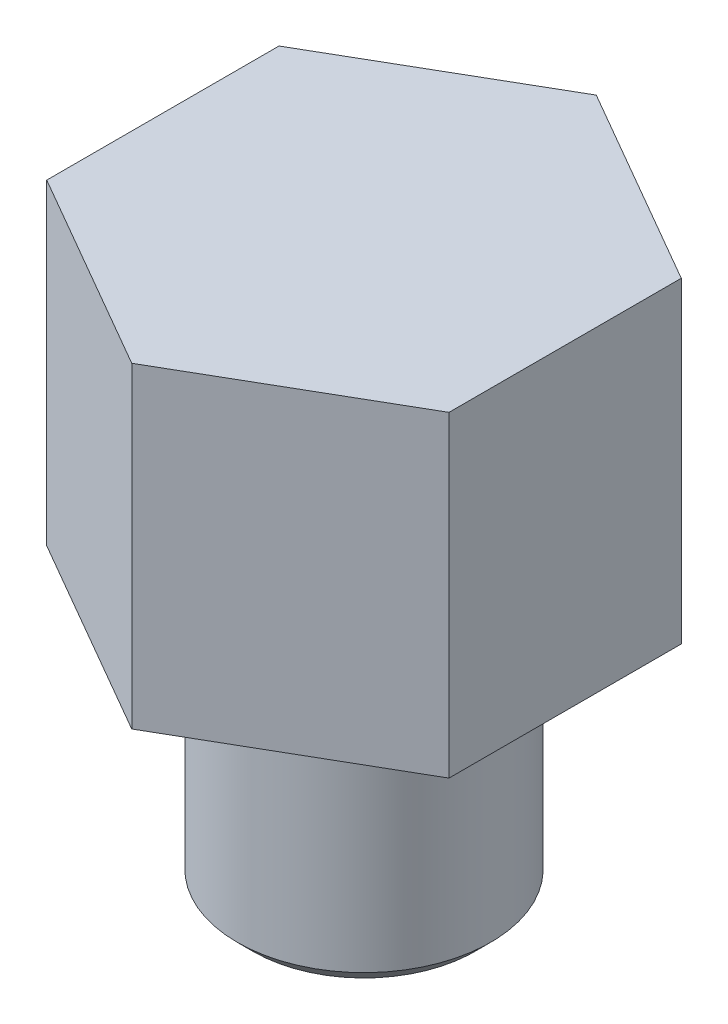
ISO-10303-21;
HEADER;
FILE_DESCRIPTION(('STEP AP214'),'2;1');
FILE_NAME('part.step','',(''),(''),'','','');
FILE_SCHEMA(('AUTOMOTIVE_DESIGN { 1 0 10303 214 1 1 1 1 }'));
ENDSEC;
DATA;
#1=APPLICATION_CONTEXT('core data for automotive mechanical design processes');
#2=APPLICATION_PROTOCOL_DEFINITION('international standard','automotive_design',2000,#1);
#3=PRODUCT_CONTEXT('',#1,'mechanical');
#4=PRODUCT('Part','Part','',(#3));
#5=PRODUCT_RELATED_PRODUCT_CATEGORY('part','',(#4));
#6=PRODUCT_DEFINITION_FORMATION('','',#4);
#7=PRODUCT_DEFINITION_CONTEXT('part definition',#1,'design');
#8=PRODUCT_DEFINITION('design','',#6,#7);
#9=PRODUCT_DEFINITION_SHAPE('','',#8);
#10=(LENGTH_UNIT() NAMED_UNIT(*) SI_UNIT(.MILLI.,.METRE.));
#11=(NAMED_UNIT(*) PLANE_ANGLE_UNIT() SI_UNIT($,.RADIAN.));
#12=(NAMED_UNIT(*) SI_UNIT($,.STERADIAN.) SOLID_ANGLE_UNIT());
#13=UNCERTAINTY_MEASURE_WITH_UNIT(LENGTH_MEASURE(1.E-05),#10,'distance_accuracy_value','');
#14=(GEOMETRIC_REPRESENTATION_CONTEXT(3) GLOBAL_UNCERTAINTY_ASSIGNED_CONTEXT((#13)) GLOBAL_UNIT_ASSIGNED_CONTEXT((#10,
#11,#12)) REPRESENTATION_CONTEXT('',''));
#15=CARTESIAN_POINT('',(0.,0.,0.));
#16=DIRECTION('',(0.,0.,1.));
#17=DIRECTION('',(1.,0.,0.));
#18=AXIS2_PLACEMENT_3D('',#15,#16,#17);
#19=CARTESIAN_POINT('',(6.35,18.,3.66617420935412));
#20=DIRECTION('',(-1.,0.,0.));
#21=DIRECTION('',(0.,0.,1.));
#22=AXIS2_PLACEMENT_3D('',#19,#20,#21);
#23=PLANE('',#22);
#24=DIRECTION('',(0.,0.,1.));
#25=VECTOR('',#24,1.);
#26=CARTESIAN_POINT('',(6.35,8.,3.66617420935412));
#27=LINE('',#26,#25);
#28=CARTESIAN_POINT('',(6.35,8.,-3.66617420935412));
#29=VERTEX_POINT('',#28);
#30=CARTESIAN_POINT('',(6.35,8.,3.66617420935412));
#31=VERTEX_POINT('',#30);
#32=EDGE_CURVE('E61',#29,#31,#27,.T.);
#33=ORIENTED_EDGE('',*,*,#32,.F.);
#34=DIRECTION('',(0.,-1.,0.));
#35=VECTOR('',#34,1.);
#36=CARTESIAN_POINT('',(6.35,18.,-3.66617420935412));
#37=LINE('',#36,#35);
#38=CARTESIAN_POINT('',(6.35,18.,-3.66617420935412));
#39=VERTEX_POINT('',#38);
#40=EDGE_CURVE('E106',#39,#29,#37,.T.);
#41=ORIENTED_EDGE('',*,*,#40,.F.);
#42=DIRECTION('',(0.,0.,-1.));
#43=VECTOR('',#42,1.);
#44=CARTESIAN_POINT('',(6.35,18.,3.66617420935412));
#45=LINE('',#44,#43);
#46=CARTESIAN_POINT('',(6.35,18.,3.66617420935412));
#47=VERTEX_POINT('',#46);
#48=EDGE_CURVE('E256',#47,#39,#45,.T.);
#49=ORIENTED_EDGE('',*,*,#48,.F.);
#50=DIRECTION('',(0.,-1.,0.));
#51=VECTOR('',#50,1.);
#52=CARTESIAN_POINT('',(6.35,18.,3.66617420935412));
#53=LINE('',#52,#51);
#54=EDGE_CURVE('E119',#47,#31,#53,.T.);
#55=ORIENTED_EDGE('',*,*,#54,.T.);
#56=EDGE_LOOP('',(#33,#41,#49,#55));
#57=FACE_BOUND('',#56,.T.);
#58=ADVANCED_FACE('F46',(#57),#23,.F.);
#59=CARTESIAN_POINT('',(6.35,18.,-3.66617420935412));
#60=DIRECTION('',(-0.5,0.,0.866025403784439));
#61=DIRECTION('',(0.866025403784439,0.,0.5));
#62=AXIS2_PLACEMENT_3D('',#59,#60,#61);
#63=PLANE('',#62);
#64=DIRECTION('',(0.866025403784439,0.,0.5));
#65=VECTOR('',#64,1.);
#66=CARTESIAN_POINT('',(6.35,8.,-3.66617420935412));
#67=LINE('',#66,#65);
#68=CARTESIAN_POINT('',(0.,8.,-7.33234841870824));
#69=VERTEX_POINT('',#68);
#70=EDGE_CURVE('E262',#69,#29,#67,.T.);
#71=ORIENTED_EDGE('',*,*,#70,.F.);
#72=DIRECTION('',(0.,-1.,0.));
#73=VECTOR('',#72,1.);
#74=CARTESIAN_POINT('',(0.,18.,-7.33234841870824));
#75=LINE('',#74,#73);
#76=CARTESIAN_POINT('',(0.,18.,-7.33234841870824));
#77=VERTEX_POINT('',#76);
#78=EDGE_CURVE('E128',#77,#69,#75,.T.);
#79=ORIENTED_EDGE('',*,*,#78,.F.);
#80=DIRECTION('',(-0.866025403784439,0.,-0.5));
#81=VECTOR('',#80,1.);
#82=CARTESIAN_POINT('',(6.35,18.,-3.66617420935412));
#83=LINE('',#82,#81);
#84=EDGE_CURVE('E258',#39,#77,#83,.T.);
#85=ORIENTED_EDGE('',*,*,#84,.F.);
#86=ORIENTED_EDGE('',*,*,#40,.T.);
#87=EDGE_LOOP('',(#71,#79,#85,#86));
#88=FACE_BOUND('',#87,.T.);
#89=ADVANCED_FACE('F153',(#88),#63,.F.);
#90=CARTESIAN_POINT('',(0.,18.,-7.33234841870824));
#91=DIRECTION('',(0.5,0.,0.866025403784439));
#92=DIRECTION('',(0.866025403784439,0.,-0.5));
#93=AXIS2_PLACEMENT_3D('',#90,#91,#92);
#94=PLANE('',#93);
#95=DIRECTION('',(0.866025403784439,0.,-0.5));
#96=VECTOR('',#95,1.);
#97=CARTESIAN_POINT('',(0.,8.,-7.33234841870824));
#98=LINE('',#97,#96);
#99=CARTESIAN_POINT('',(-6.35,8.,-3.66617420935413));
#100=VERTEX_POINT('',#99);
#101=EDGE_CURVE('E275',#100,#69,#98,.T.);
#102=ORIENTED_EDGE('',*,*,#101,.F.);
#103=DIRECTION('',(0.,-1.,0.));
#104=VECTOR('',#103,1.);
#105=CARTESIAN_POINT('',(-6.35,18.,-3.66617420935413));
#106=LINE('',#105,#104);
#107=CARTESIAN_POINT('',(-6.35,18.,-3.66617420935413));
#108=VERTEX_POINT('',#107);
#109=EDGE_CURVE('E121',#108,#100,#106,.T.);
#110=ORIENTED_EDGE('',*,*,#109,.F.);
#111=DIRECTION('',(-0.866025403784439,0.,0.5));
#112=VECTOR('',#111,1.);
#113=CARTESIAN_POINT('',(0.,18.,-7.33234841870824));
#114=LINE('',#113,#112);
#115=EDGE_CURVE('E264',#77,#108,#114,.T.);
#116=ORIENTED_EDGE('',*,*,#115,.F.);
#117=ORIENTED_EDGE('',*,*,#78,.T.);
#118=EDGE_LOOP('',(#102,#110,#116,#117));
#119=FACE_BOUND('',#118,.T.);
#120=ADVANCED_FACE('F159',(#119),#94,.F.);
#121=CARTESIAN_POINT('',(-6.35,18.,-3.66617420935413));
#122=DIRECTION('',(1.,0.,0.));
#123=DIRECTION('',(0.,0.,-1.));
#124=AXIS2_PLACEMENT_3D('',#121,#122,#123);
#125=PLANE('',#124);
#126=DIRECTION('',(0.,0.,-1.));
#127=VECTOR('',#126,1.);
#128=CARTESIAN_POINT('',(-6.35,8.,-3.66617420935413));
#129=LINE('',#128,#127);
#130=CARTESIAN_POINT('',(-6.35,8.,3.66617420935412));
#131=VERTEX_POINT('',#130);
#132=EDGE_CURVE('E116',#131,#100,#129,.T.);
#133=ORIENTED_EDGE('',*,*,#132,.F.);
#134=DIRECTION('',(0.,-1.,0.));
#135=VECTOR('',#134,1.);
#136=CARTESIAN_POINT('',(-6.35,18.,3.66617420935412));
#137=LINE('',#136,#135);
#138=CARTESIAN_POINT('',(-6.35,18.,3.66617420935412));
#139=VERTEX_POINT('',#138);
#140=EDGE_CURVE('E115',#139,#131,#137,.T.);
#141=ORIENTED_EDGE('',*,*,#140,.F.);
#142=DIRECTION('',(0.,0.,1.));
#143=VECTOR('',#142,1.);
#144=CARTESIAN_POINT('',(-6.35,18.,-3.66617420935413));
#145=LINE('',#144,#143);
#146=EDGE_CURVE('E266',#108,#139,#145,.T.);
#147=ORIENTED_EDGE('',*,*,#146,.F.);
#148=ORIENTED_EDGE('',*,*,#109,.T.);
#149=EDGE_LOOP('',(#133,#141,#147,#148));
#150=FACE_BOUND('',#149,.T.);
#151=ADVANCED_FACE('F168',(#150),#125,.F.);
#152=CARTESIAN_POINT('',(-6.35,18.,3.66617420935412));
#153=DIRECTION('',(0.5,0.,-0.866025403784439));
#154=DIRECTION('',(-0.866025403784439,0.,-0.5));
#155=AXIS2_PLACEMENT_3D('',#152,#153,#154);
#156=PLANE('',#155);
#157=DIRECTION('',(-0.866025403784439,0.,-0.5));
#158=VECTOR('',#157,1.);
#159=CARTESIAN_POINT('',(-6.35,8.,3.66617420935412));
#160=LINE('',#159,#158);
#161=CARTESIAN_POINT('',(0.,8.,7.33234841870824));
#162=VERTEX_POINT('',#161);
#163=EDGE_CURVE('E100',#162,#131,#160,.T.);
#164=ORIENTED_EDGE('',*,*,#163,.F.);
#165=DIRECTION('',(0.,-1.,0.));
#166=VECTOR('',#165,1.);
#167=CARTESIAN_POINT('',(0.,18.,7.33234841870824));
#168=LINE('',#167,#166);
#169=CARTESIAN_POINT('',(0.,18.,7.33234841870824));
#170=VERTEX_POINT('',#169);
#171=EDGE_CURVE('E113',#170,#162,#168,.T.);
#172=ORIENTED_EDGE('',*,*,#171,.F.);
#173=DIRECTION('',(0.866025403784438,0.,0.5));
#174=VECTOR('',#173,1.);
#175=CARTESIAN_POINT('',(-6.35,18.,3.66617420935412));
#176=LINE('',#175,#174);
#177=EDGE_CURVE('E271',#139,#170,#176,.T.);
#178=ORIENTED_EDGE('',*,*,#177,.F.);
#179=ORIENTED_EDGE('',*,*,#140,.T.);
#180=EDGE_LOOP('',(#164,#172,#178,#179));
#181=FACE_BOUND('',#180,.T.);
#182=ADVANCED_FACE('F111',(#181),#156,.F.);
#183=CARTESIAN_POINT('',(0.,18.,7.33234841870824));
#184=DIRECTION('',(-0.5,0.,-0.866025403784439));
#185=DIRECTION('',(-0.866025403784439,0.,0.5));
#186=AXIS2_PLACEMENT_3D('',#183,#184,#185);
#187=PLANE('',#186);
#188=DIRECTION('',(-0.866025403784439,0.,0.5));
#189=VECTOR('',#188,1.);
#190=CARTESIAN_POINT('',(0.,8.,7.33234841870824));
#191=LINE('',#190,#189);
#192=EDGE_CURVE('E97',#31,#162,#191,.T.);
#193=ORIENTED_EDGE('',*,*,#192,.F.);
#194=ORIENTED_EDGE('',*,*,#54,.F.);
#195=DIRECTION('',(0.866025403784439,0.,-0.5));
#196=VECTOR('',#195,1.);
#197=CARTESIAN_POINT('',(0.,18.,7.33234841870824));
#198=LINE('',#197,#196);
#199=EDGE_CURVE('E69',#170,#47,#198,.T.);
#200=ORIENTED_EDGE('',*,*,#199,.F.);
#201=ORIENTED_EDGE('',*,*,#171,.T.);
#202=EDGE_LOOP('',(#193,#194,#200,#201));
#203=FACE_BOUND('',#202,.T.);
#204=ADVANCED_FACE('F118',(#203),#187,.F.);
#205=CARTESIAN_POINT('',(0.,18.,0.));
#206=DIRECTION('',(0.,1.,0.));
#207=DIRECTION('',(0.,0.,1.));
#208=AXIS2_PLACEMENT_3D('',#205,#206,#207);
#209=PLANE('',#208);
#210=ORIENTED_EDGE('',*,*,#48,.T.);
#211=ORIENTED_EDGE('',*,*,#84,.T.);
#212=ORIENTED_EDGE('',*,*,#115,.T.);
#213=ORIENTED_EDGE('',*,*,#146,.T.);
#214=ORIENTED_EDGE('',*,*,#177,.T.);
#215=ORIENTED_EDGE('',*,*,#199,.T.);
#216=EDGE_LOOP('',(#210,#211,#212,#213,#214,#215));
#217=FACE_BOUND('',#216,.T.);
#218=ADVANCED_FACE('F177',(#217),#209,.T.);
#219=CARTESIAN_POINT('',(0.,8.,0.));
#220=DIRECTION('',(0.,-1.,0.));
#221=DIRECTION('',(0.,0.,-1.));
#222=AXIS2_PLACEMENT_3D('',#219,#220,#221);
#223=PLANE('',#222);
#224=CARTESIAN_POINT('',(0.,8.,0.));
#225=DIRECTION('',(0.,-1.,0.));
#226=DIRECTION('',(0.,0.,-1.));
#227=AXIS2_PLACEMENT_3D('',#224,#225,#226);
#228=CIRCLE('',#227,4.5);
#229=CARTESIAN_POINT('',(0.,8.,-4.5));
#230=VERTEX_POINT('',#229);
#231=EDGE_CURVE('E13',#230,#230,#228,.F.);
#232=ORIENTED_EDGE('',*,*,#231,.T.);
#233=EDGE_LOOP('',(#232));
#234=FACE_BOUND('',#233,.T.);
#235=ORIENTED_EDGE('',*,*,#32,.T.);
#236=ORIENTED_EDGE('',*,*,#192,.T.);
#237=ORIENTED_EDGE('',*,*,#163,.T.);
#238=ORIENTED_EDGE('',*,*,#132,.T.);
#239=ORIENTED_EDGE('',*,*,#101,.T.);
#240=ORIENTED_EDGE('',*,*,#70,.T.);
#241=EDGE_LOOP('',(#235,#236,#237,#238,#239,#240));
#242=FACE_BOUND('',#241,.T.);
#243=ADVANCED_FACE('F99',(#234,#242),#223,.T.);
#244=CARTESIAN_POINT('',(0.,8.,0.));
#245=DIRECTION('',(0.,-1.,0.));
#246=DIRECTION('',(0.,0.,-1.));
#247=AXIS2_PLACEMENT_3D('',#244,#245,#246);
#248=CYLINDRICAL_SURFACE('',#247,4.);
#249=CARTESIAN_POINT('',(0.,7.5,0.));
#250=DIRECTION('',(0.,-1.,0.));
#251=DIRECTION('',(0.,0.,-1.));
#252=AXIS2_PLACEMENT_3D('',#249,#250,#251);
#253=CIRCLE('',#252,4.);
#254=CARTESIAN_POINT('',(0.,7.5,-4.));
#255=VERTEX_POINT('',#254);
#256=EDGE_CURVE('E54',#255,#255,#253,.T.);
#257=ORIENTED_EDGE('',*,*,#256,.T.);
#258=EDGE_LOOP('',(#257));
#259=FACE_BOUND('',#258,.T.);
#260=CARTESIAN_POINT('',(0.,0.500000000000007,0.));
#261=DIRECTION('',(0.,1.,0.));
#262=DIRECTION('',(0.,0.,1.));
#263=AXIS2_PLACEMENT_3D('',#260,#261,#262);
#264=CIRCLE('',#263,4.);
#265=CARTESIAN_POINT('',(0.,0.500000000000007,4.));
#266=VERTEX_POINT('',#265);
#267=EDGE_CURVE('E135',#266,#266,#264,.T.);
#268=ORIENTED_EDGE('',*,*,#267,.T.);
#269=EDGE_LOOP('',(#268));
#270=FACE_BOUND('',#269,.T.);
#271=ADVANCED_FACE('F140',(#259,#270),#248,.T.);
#272=CARTESIAN_POINT('',(0.,0.,0.));
#273=DIRECTION('',(0.,1.,0.));
#274=DIRECTION('',(0.,0.,1.));
#275=AXIS2_PLACEMENT_3D('',#272,#273,#274);
#276=PLANE('',#275);
#277=CARTESIAN_POINT('',(0.,0.,0.));
#278=DIRECTION('',(0.,1.,0.));
#279=DIRECTION('',(0.,0.,1.));
#280=AXIS2_PLACEMENT_3D('',#277,#278,#279);
#281=CIRCLE('',#280,3.5);
#282=CARTESIAN_POINT('',(0.,0.,3.5));
#283=VERTEX_POINT('',#282);
#284=EDGE_CURVE('E105',#283,#283,#281,.F.);
#285=ORIENTED_EDGE('',*,*,#284,.T.);
#286=EDGE_LOOP('',(#285));
#287=FACE_BOUND('',#286,.T.);
#288=ADVANCED_FACE('F149',(#287),#276,.F.);
#289=CARTESIAN_POINT('',(0.,0.,0.));
#290=DIRECTION('',(0.,1.,0.));
#291=DIRECTION('',(0.,0.,1.));
#292=AXIS2_PLACEMENT_3D('',#289,#290,#291);
#293=CONICAL_SURFACE('',#292,3.5,0.785398163397445);
#294=ORIENTED_EDGE('',*,*,#267,.F.);
#295=EDGE_LOOP('',(#294));
#296=FACE_BOUND('',#295,.T.);
#297=ORIENTED_EDGE('',*,*,#284,.F.);
#298=EDGE_LOOP('',(#297));
#299=FACE_BOUND('',#298,.T.);
#300=ADVANCED_FACE('F144',(#296,#299),#293,.T.);
#301=CARTESIAN_POINT('',(0.,7.5,0.));
#302=DIRECTION('',(0.,-1.,0.));
#303=DIRECTION('',(0.,0.,-1.));
#304=AXIS2_PLACEMENT_3D('',#301,#302,#303);
#305=TOROIDAL_SURFACE('',#304,4.5,0.5);
#306=ORIENTED_EDGE('',*,*,#231,.F.);
#307=EDGE_LOOP('',(#306));
#308=FACE_BOUND('',#307,.T.);
#309=ORIENTED_EDGE('',*,*,#256,.F.);
#310=EDGE_LOOP('',(#309));
#311=FACE_BOUND('',#310,.T.);
#312=ADVANCED_FACE('F48',(#308,#311),#305,.F.);
#313=CLOSED_SHELL('',(#58,#89,#120,#151,#182,#204,#218,#243,#271,#288,#300,#312));
#314=MANIFOLD_SOLID_BREP('B2',#313);
#315=ADVANCED_BREP_SHAPE_REPRESENTATION('',(#18,#314),#14);
#316=SHAPE_DEFINITION_REPRESENTATION(#9,#315);
ENDSEC;
END-ISO-10303-21;
